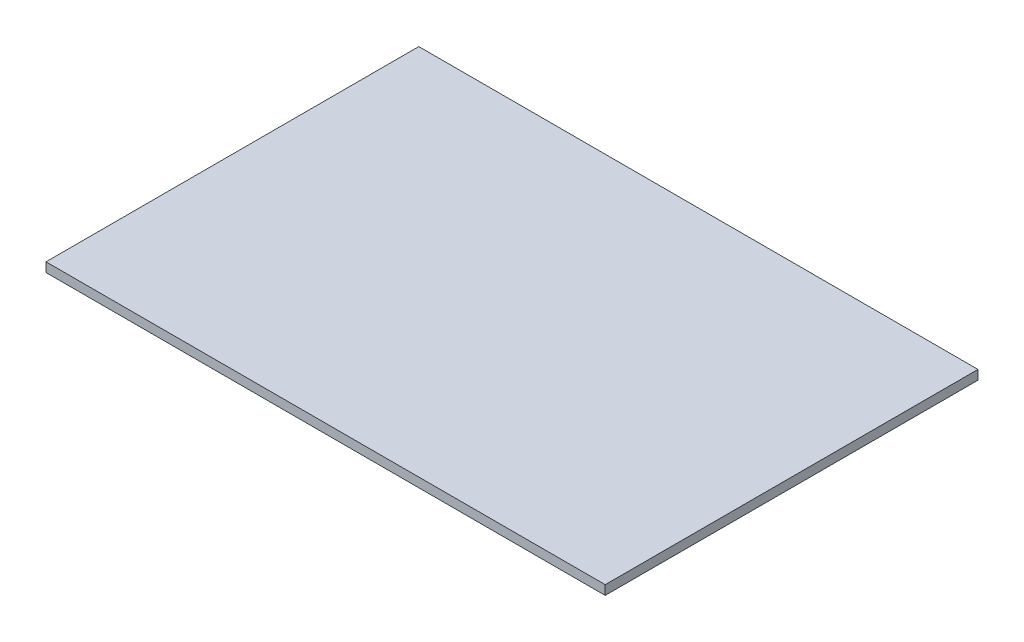
ISO-10303-21;
HEADER;
FILE_DESCRIPTION(('STEP AP214'),'2;1');
FILE_NAME('part.step','',(''),(''),'','','');
FILE_SCHEMA(('AUTOMOTIVE_DESIGN { 1 0 10303 214 1 1 1 1 }'));
ENDSEC;
DATA;
#1=APPLICATION_CONTEXT('core data for automotive mechanical design processes');
#2=APPLICATION_PROTOCOL_DEFINITION('international standard','automotive_design',2000,#1);
#3=PRODUCT_CONTEXT('',#1,'mechanical');
#4=PRODUCT('Part','Part','',(#3));
#5=PRODUCT_RELATED_PRODUCT_CATEGORY('part','',(#4));
#6=PRODUCT_DEFINITION_FORMATION('','',#4);
#7=PRODUCT_DEFINITION_CONTEXT('part definition',#1,'design');
#8=PRODUCT_DEFINITION('design','',#6,#7);
#9=PRODUCT_DEFINITION_SHAPE('','',#8);
#10=(LENGTH_UNIT() NAMED_UNIT(*) SI_UNIT(.MILLI.,.METRE.));
#11=(NAMED_UNIT(*) PLANE_ANGLE_UNIT() SI_UNIT($,.RADIAN.));
#12=(NAMED_UNIT(*) SI_UNIT($,.STERADIAN.) SOLID_ANGLE_UNIT());
#13=UNCERTAINTY_MEASURE_WITH_UNIT(LENGTH_MEASURE(1.E-05),#10,'distance_accuracy_value','');
#14=(GEOMETRIC_REPRESENTATION_CONTEXT(3) GLOBAL_UNCERTAINTY_ASSIGNED_CONTEXT((#13)) GLOBAL_UNIT_ASSIGNED_CONTEXT((#10,
#11,#12)) REPRESENTATION_CONTEXT('',''));
#15=CARTESIAN_POINT('',(0.,0.,0.));
#16=DIRECTION('',(0.,0.,1.));
#17=DIRECTION('',(1.,0.,0.));
#18=AXIS2_PLACEMENT_3D('',#15,#16,#17);
#19=CARTESIAN_POINT('',(1500.,50.,-1000.));
#20=DIRECTION('',(-1.,0.,0.));
#21=DIRECTION('',(0.,0.,1.));
#22=AXIS2_PLACEMENT_3D('',#19,#20,#21);
#23=PLANE('',#22);
#24=DIRECTION('',(0.,0.,-1.));
#25=VECTOR('',#24,1.);
#26=CARTESIAN_POINT('',(1500.,0.,-1000.));
#27=LINE('',#26,#25);
#28=CARTESIAN_POINT('',(1500.,0.,1000.));
#29=VERTEX_POINT('',#28);
#30=CARTESIAN_POINT('',(1500.,0.,-1000.));
#31=VERTEX_POINT('',#30);
#32=EDGE_CURVE('E98',#29,#31,#27,.T.);
#33=ORIENTED_EDGE('',*,*,#32,.T.);
#34=DIRECTION('',(0.,-1.,0.));
#35=VECTOR('',#34,1.);
#36=CARTESIAN_POINT('',(1500.,50.,-1000.));
#37=LINE('',#36,#35);
#38=CARTESIAN_POINT('',(1500.,50.,-1000.));
#39=VERTEX_POINT('',#38);
#40=EDGE_CURVE('E11',#39,#31,#37,.T.);
#41=ORIENTED_EDGE('',*,*,#40,.F.);
#42=DIRECTION('',(0.,0.,-1.));
#43=VECTOR('',#42,1.);
#44=CARTESIAN_POINT('',(1500.,50.,-1000.));
#45=LINE('',#44,#43);
#46=CARTESIAN_POINT('',(1500.,50.,1000.));
#47=VERTEX_POINT('',#46);
#48=EDGE_CURVE('E86',#47,#39,#45,.T.);
#49=ORIENTED_EDGE('',*,*,#48,.F.);
#50=DIRECTION('',(0.,-1.,0.));
#51=VECTOR('',#50,1.);
#52=CARTESIAN_POINT('',(1500.,50.,1000.));
#53=LINE('',#52,#51);
#54=EDGE_CURVE('E94',#47,#29,#53,.T.);
#55=ORIENTED_EDGE('',*,*,#54,.T.);
#56=EDGE_LOOP('',(#33,#41,#49,#55));
#57=FACE_BOUND('',#56,.T.);
#58=ADVANCED_FACE('F35',(#57),#23,.F.);
#59=CARTESIAN_POINT('',(-1500.,50.,-1000.));
#60=DIRECTION('',(0.,0.,1.));
#61=DIRECTION('',(1.,0.,0.));
#62=AXIS2_PLACEMENT_3D('',#59,#60,#61);
#63=PLANE('',#62);
#64=DIRECTION('',(-1.,0.,0.));
#65=VECTOR('',#64,1.);
#66=CARTESIAN_POINT('',(-1500.,0.,-1000.));
#67=LINE('',#66,#65);
#68=CARTESIAN_POINT('',(-1500.,0.,-1000.));
#69=VERTEX_POINT('',#68);
#70=EDGE_CURVE('E90',#31,#69,#67,.T.);
#71=ORIENTED_EDGE('',*,*,#70,.T.);
#72=DIRECTION('',(0.,-1.,0.));
#73=VECTOR('',#72,1.);
#74=CARTESIAN_POINT('',(-1500.,50.,-1000.));
#75=LINE('',#74,#73);
#76=CARTESIAN_POINT('',(-1500.,50.,-1000.));
#77=VERTEX_POINT('',#76);
#78=EDGE_CURVE('E43',#77,#69,#75,.T.);
#79=ORIENTED_EDGE('',*,*,#78,.F.);
#80=DIRECTION('',(-1.,0.,0.));
#81=VECTOR('',#80,1.);
#82=CARTESIAN_POINT('',(-1500.,50.,-1000.));
#83=LINE('',#82,#81);
#84=EDGE_CURVE('E81',#39,#77,#83,.T.);
#85=ORIENTED_EDGE('',*,*,#84,.F.);
#86=ORIENTED_EDGE('',*,*,#40,.T.);
#87=EDGE_LOOP('',(#71,#79,#85,#86));
#88=FACE_BOUND('',#87,.T.);
#89=ADVANCED_FACE('F89',(#88),#63,.F.);
#90=CARTESIAN_POINT('',(-1500.,50.,-1000.));
#91=DIRECTION('',(1.,0.,0.));
#92=DIRECTION('',(0.,0.,-1.));
#93=AXIS2_PLACEMENT_3D('',#90,#91,#92);
#94=PLANE('',#93);
#95=DIRECTION('',(0.,0.,1.));
#96=VECTOR('',#95,1.);
#97=CARTESIAN_POINT('',(-1500.,0.,-1000.));
#98=LINE('',#97,#96);
#99=CARTESIAN_POINT('',(-1500.,0.,1000.));
#100=VERTEX_POINT('',#99);
#101=EDGE_CURVE('E68',#69,#100,#98,.T.);
#102=ORIENTED_EDGE('',*,*,#101,.T.);
#103=DIRECTION('',(0.,-1.,0.));
#104=VECTOR('',#103,1.);
#105=CARTESIAN_POINT('',(-1500.,50.,1000.));
#106=LINE('',#105,#104);
#107=CARTESIAN_POINT('',(-1500.,50.,1000.));
#108=VERTEX_POINT('',#107);
#109=EDGE_CURVE('E91',#108,#100,#106,.T.);
#110=ORIENTED_EDGE('',*,*,#109,.F.);
#111=DIRECTION('',(0.,0.,1.));
#112=VECTOR('',#111,1.);
#113=CARTESIAN_POINT('',(-1500.,50.,-1000.));
#114=LINE('',#113,#112);
#115=EDGE_CURVE('E84',#77,#108,#114,.T.);
#116=ORIENTED_EDGE('',*,*,#115,.F.);
#117=ORIENTED_EDGE('',*,*,#78,.T.);
#118=EDGE_LOOP('',(#102,#110,#116,#117));
#119=FACE_BOUND('',#118,.T.);
#120=ADVANCED_FACE('F92',(#119),#94,.F.);
#121=CARTESIAN_POINT('',(-1500.,50.,1000.));
#122=DIRECTION('',(0.,0.,-1.));
#123=DIRECTION('',(-1.,0.,0.));
#124=AXIS2_PLACEMENT_3D('',#121,#122,#123);
#125=PLANE('',#124);
#126=DIRECTION('',(1.,0.,0.));
#127=VECTOR('',#126,1.);
#128=CARTESIAN_POINT('',(-1500.,0.,1000.));
#129=LINE('',#128,#127);
#130=EDGE_CURVE('E74',#100,#29,#129,.T.);
#131=ORIENTED_EDGE('',*,*,#130,.T.);
#132=ORIENTED_EDGE('',*,*,#54,.F.);
#133=DIRECTION('',(1.,0.,0.));
#134=VECTOR('',#133,1.);
#135=CARTESIAN_POINT('',(-1500.,50.,1000.));
#136=LINE('',#135,#134);
#137=EDGE_CURVE('E51',#108,#47,#136,.T.);
#138=ORIENTED_EDGE('',*,*,#137,.F.);
#139=ORIENTED_EDGE('',*,*,#109,.T.);
#140=EDGE_LOOP('',(#131,#132,#138,#139));
#141=FACE_BOUND('',#140,.T.);
#142=ADVANCED_FACE('F105',(#141),#125,.F.);
#143=CARTESIAN_POINT('',(0.,50.,0.));
#144=DIRECTION('',(0.,1.,0.));
#145=DIRECTION('',(0.,0.,1.));
#146=AXIS2_PLACEMENT_3D('',#143,#144,#145);
#147=PLANE('',#146);
#148=ORIENTED_EDGE('',*,*,#48,.T.);
#149=ORIENTED_EDGE('',*,*,#84,.T.);
#150=ORIENTED_EDGE('',*,*,#115,.T.);
#151=ORIENTED_EDGE('',*,*,#137,.T.);
#152=EDGE_LOOP('',(#148,#149,#150,#151));
#153=FACE_BOUND('',#152,.T.);
#154=ADVANCED_FACE('F82',(#153),#147,.T.);
#155=CARTESIAN_POINT('',(0.,0.,0.));
#156=DIRECTION('',(0.,1.,0.));
#157=DIRECTION('',(0.,0.,1.));
#158=AXIS2_PLACEMENT_3D('',#155,#156,#157);
#159=PLANE('',#158);
#160=ORIENTED_EDGE('',*,*,#32,.F.);
#161=ORIENTED_EDGE('',*,*,#130,.F.);
#162=ORIENTED_EDGE('',*,*,#101,.F.);
#163=ORIENTED_EDGE('',*,*,#70,.F.);
#164=EDGE_LOOP('',(#160,#161,#162,#163));
#165=FACE_BOUND('',#164,.T.);
#166=ADVANCED_FACE('F108',(#165),#159,.F.);
#167=CLOSED_SHELL('',(#58,#89,#120,#142,#154,#166));
#168=MANIFOLD_SOLID_BREP('B2',#167);
#169=ADVANCED_BREP_SHAPE_REPRESENTATION('',(#18,#168),#14);
#170=SHAPE_DEFINITION_REPRESENTATION(#9,#169);
ENDSEC;
END-ISO-10303-21;
